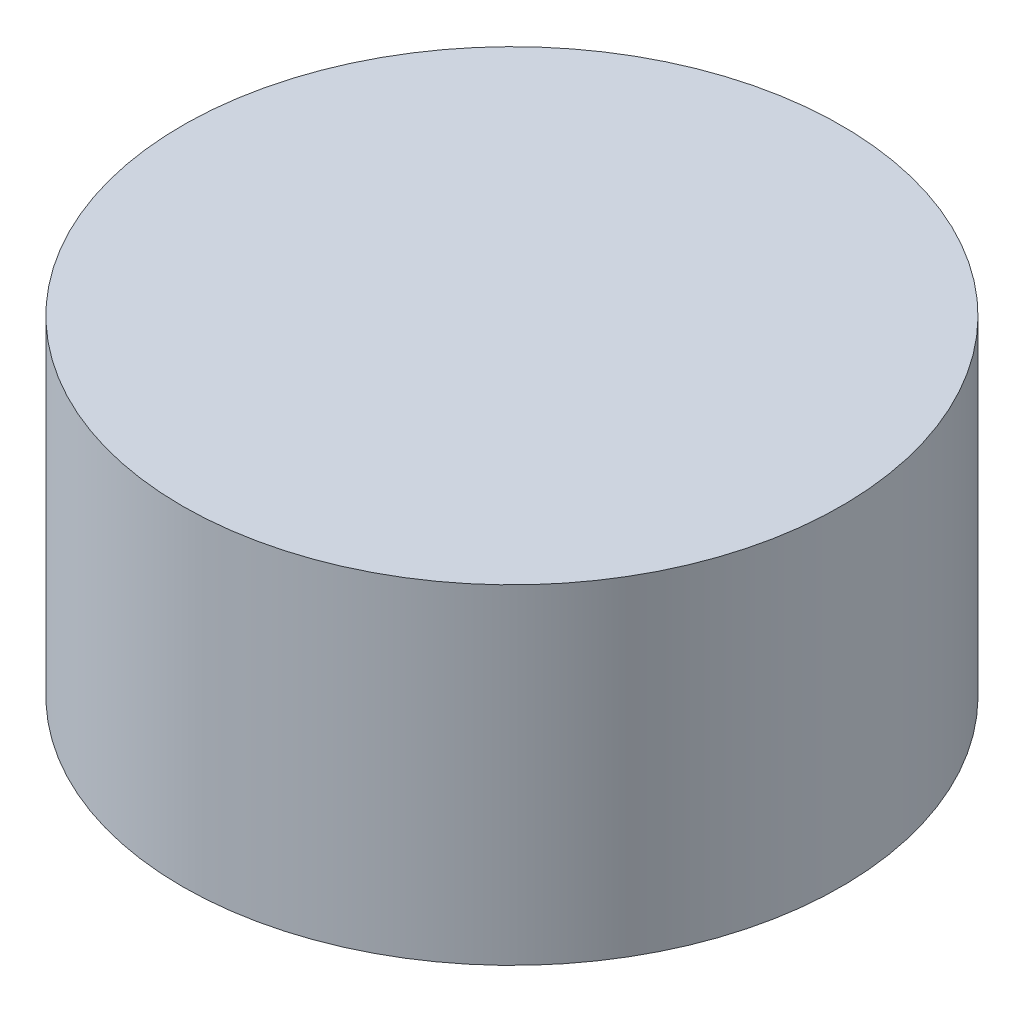
ISO-10303-21;
HEADER;
FILE_DESCRIPTION(('STEP AP214'),'2;1');
FILE_NAME('part.step','',(''),(''),'','','');
FILE_SCHEMA(('AUTOMOTIVE_DESIGN { 1 0 10303 214 1 1 1 1 }'));
ENDSEC;
DATA;
#1=APPLICATION_CONTEXT('core data for automotive mechanical design processes');
#2=APPLICATION_PROTOCOL_DEFINITION('international standard','automotive_design',2000,#1);
#3=PRODUCT_CONTEXT('',#1,'mechanical');
#4=PRODUCT('Part','Part','',(#3));
#5=PRODUCT_RELATED_PRODUCT_CATEGORY('part','',(#4));
#6=PRODUCT_DEFINITION_FORMATION('','',#4);
#7=PRODUCT_DEFINITION_CONTEXT('part definition',#1,'design');
#8=PRODUCT_DEFINITION('design','',#6,#7);
#9=PRODUCT_DEFINITION_SHAPE('','',#8);
#10=(LENGTH_UNIT() NAMED_UNIT(*) SI_UNIT(.MILLI.,.METRE.));
#11=(NAMED_UNIT(*) PLANE_ANGLE_UNIT() SI_UNIT($,.RADIAN.));
#12=(NAMED_UNIT(*) SI_UNIT($,.STERADIAN.) SOLID_ANGLE_UNIT());
#13=UNCERTAINTY_MEASURE_WITH_UNIT(LENGTH_MEASURE(1.E-05),#10,'distance_accuracy_value','');
#14=(GEOMETRIC_REPRESENTATION_CONTEXT(3) GLOBAL_UNCERTAINTY_ASSIGNED_CONTEXT((#13)) GLOBAL_UNIT_ASSIGNED_CONTEXT((#10,
#11,#12)) REPRESENTATION_CONTEXT('',''));
#15=CARTESIAN_POINT('',(0.,0.,0.));
#16=DIRECTION('',(0.,0.,1.));
#17=DIRECTION('',(1.,0.,0.));
#18=AXIS2_PLACEMENT_3D('',#15,#16,#17);
#19=CARTESIAN_POINT('',(0.,1.,0.));
#20=DIRECTION('',(0.,-1.,0.));
#21=DIRECTION('',(0.,0.,-1.));
#22=AXIS2_PLACEMENT_3D('',#19,#20,#21);
#23=CYLINDRICAL_SURFACE('',#22,1.);
#24=CARTESIAN_POINT('',(0.,1.,0.));
#25=DIRECTION('',(0.,1.,0.));
#26=DIRECTION('',(0.,0.,1.));
#27=AXIS2_PLACEMENT_3D('',#24,#25,#26);
#28=CIRCLE('',#27,1.);
#29=CARTESIAN_POINT('',(0.,1.,1.));
#30=VERTEX_POINT('',#29);
#31=EDGE_CURVE('E10',#30,#30,#28,.T.);
#32=ORIENTED_EDGE('',*,*,#31,.F.);
#33=EDGE_LOOP('',(#32));
#34=FACE_BOUND('',#33,.T.);
#35=CARTESIAN_POINT('',(0.,0.,0.));
#36=DIRECTION('',(0.,1.,0.));
#37=DIRECTION('',(0.,0.,1.));
#38=AXIS2_PLACEMENT_3D('',#35,#36,#37);
#39=CIRCLE('',#38,1.);
#40=CARTESIAN_POINT('',(0.,0.,1.));
#41=VERTEX_POINT('',#40);
#42=EDGE_CURVE('E39',#41,#41,#39,.T.);
#43=ORIENTED_EDGE('',*,*,#42,.T.);
#44=EDGE_LOOP('',(#43));
#45=FACE_BOUND('',#44,.T.);
#46=ADVANCED_FACE('F36',(#34,#45),#23,.T.);
#47=CARTESIAN_POINT('',(0.,1.,0.));
#48=DIRECTION('',(0.,1.,0.));
#49=DIRECTION('',(0.,0.,1.));
#50=AXIS2_PLACEMENT_3D('',#47,#48,#49);
#51=PLANE('',#50);
#52=ORIENTED_EDGE('',*,*,#31,.T.);
#53=EDGE_LOOP('',(#52));
#54=FACE_BOUND('',#53,.T.);
#55=ADVANCED_FACE('F51',(#54),#51,.T.);
#56=CARTESIAN_POINT('',(0.,0.,0.));
#57=DIRECTION('',(0.,1.,0.));
#58=DIRECTION('',(0.,0.,1.));
#59=AXIS2_PLACEMENT_3D('',#56,#57,#58);
#60=PLANE('',#59);
#61=ORIENTED_EDGE('',*,*,#42,.F.);
#62=EDGE_LOOP('',(#61));
#63=FACE_BOUND('',#62,.T.);
#64=ADVANCED_FACE('F49',(#63),#60,.F.);
#65=CLOSED_SHELL('',(#46,#55,#64));
#66=MANIFOLD_SOLID_BREP('B2',#65);
#67=ADVANCED_BREP_SHAPE_REPRESENTATION('',(#18,#66),#14);
#68=SHAPE_DEFINITION_REPRESENTATION(#9,#67);
ENDSEC;
END-ISO-10303-21;
